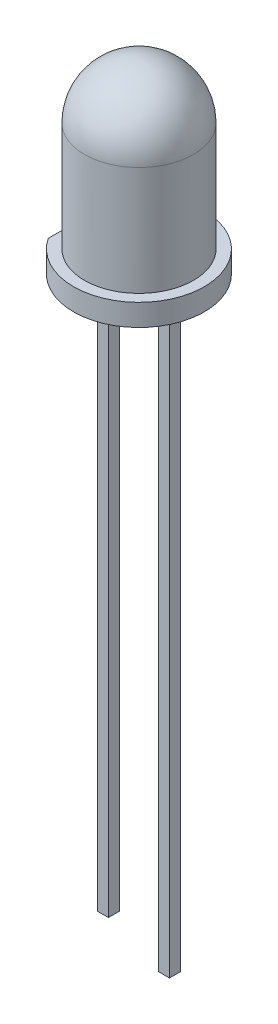
ISO-10303-21;
HEADER;
FILE_DESCRIPTION(('STEP AP214'),'2;1');
FILE_NAME('part.step','',(''),(''),'','','');
FILE_SCHEMA(('AUTOMOTIVE_DESIGN { 1 0 10303 214 1 1 1 1 }'));
ENDSEC;
DATA;
#1=APPLICATION_CONTEXT('core data for automotive mechanical design processes');
#2=APPLICATION_PROTOCOL_DEFINITION('international standard','automotive_design',2000,#1);
#3=PRODUCT_CONTEXT('',#1,'mechanical');
#4=PRODUCT('Part','Part','',(#3));
#5=PRODUCT_RELATED_PRODUCT_CATEGORY('part','',(#4));
#6=PRODUCT_DEFINITION_FORMATION('','',#4);
#7=PRODUCT_DEFINITION_CONTEXT('part definition',#1,'design');
#8=PRODUCT_DEFINITION('design','',#6,#7);
#9=PRODUCT_DEFINITION_SHAPE('','',#8);
#10=(LENGTH_UNIT() NAMED_UNIT(*) SI_UNIT(.MILLI.,.METRE.));
#11=(NAMED_UNIT(*) PLANE_ANGLE_UNIT() SI_UNIT($,.RADIAN.));
#12=(NAMED_UNIT(*) SI_UNIT($,.STERADIAN.) SOLID_ANGLE_UNIT());
#13=UNCERTAINTY_MEASURE_WITH_UNIT(LENGTH_MEASURE(1.E-05),#10,'distance_accuracy_value','');
#14=(GEOMETRIC_REPRESENTATION_CONTEXT(3) GLOBAL_UNCERTAINTY_ASSIGNED_CONTEXT((#13)) GLOBAL_UNIT_ASSIGNED_CONTEXT((#10,
#11,#12)) REPRESENTATION_CONTEXT('',''));
#15=CARTESIAN_POINT('',(0.,0.,0.));
#16=DIRECTION('',(0.,0.,1.));
#17=DIRECTION('',(1.,0.,0.));
#18=AXIS2_PLACEMENT_3D('',#15,#16,#17);
#19=CARTESIAN_POINT('',(0.,1.,0.));
#20=DIRECTION('',(0.,-1.,0.));
#21=DIRECTION('',(0.,0.,-1.));
#22=AXIS2_PLACEMENT_3D('',#19,#20,#21);
#23=CYLINDRICAL_SURFACE('',#22,3.);
#24=CARTESIAN_POINT('',(0.,0.,0.));
#25=DIRECTION('',(0.,1.,0.));
#26=DIRECTION('',(0.,0.,1.));
#27=AXIS2_PLACEMENT_3D('',#24,#25,#26);
#28=CIRCLE('',#27,3.);
#29=CARTESIAN_POINT('',(-2.5,0.,1.6583123951777));
#30=VERTEX_POINT('',#29);
#31=CARTESIAN_POINT('',(-2.5,0.,-1.6583123951777));
#32=VERTEX_POINT('',#31);
#33=EDGE_CURVE('E183',#30,#32,#28,.T.);
#34=ORIENTED_EDGE('',*,*,#33,.T.);
#35=DIRECTION('',(0.,-1.,0.));
#36=VECTOR('',#35,1.);
#37=CARTESIAN_POINT('',(-2.5,1.,-1.6583123951777));
#38=LINE('',#37,#36);
#39=CARTESIAN_POINT('',(-2.5,1.,-1.6583123951777));
#40=VERTEX_POINT('',#39);
#41=EDGE_CURVE('E40',#40,#32,#38,.T.);
#42=ORIENTED_EDGE('',*,*,#41,.F.);
#43=CARTESIAN_POINT('',(0.,1.,0.));
#44=DIRECTION('',(0.,1.,0.));
#45=DIRECTION('',(0.,0.,1.));
#46=AXIS2_PLACEMENT_3D('',#43,#44,#45);
#47=CIRCLE('',#46,3.);
#48=CARTESIAN_POINT('',(-2.5,1.,1.6583123951777));
#49=VERTEX_POINT('',#48);
#50=EDGE_CURVE('E184',#49,#40,#47,.T.);
#51=ORIENTED_EDGE('',*,*,#50,.F.);
#52=DIRECTION('',(0.,-1.,0.));
#53=VECTOR('',#52,1.);
#54=CARTESIAN_POINT('',(-2.5,1.,1.6583123951777));
#55=LINE('',#54,#53);
#56=EDGE_CURVE('E191',#49,#30,#55,.T.);
#57=ORIENTED_EDGE('',*,*,#56,.T.);
#58=EDGE_LOOP('',(#34,#42,#51,#57));
#59=FACE_BOUND('',#58,.T.);
#60=ADVANCED_FACE('F32',(#59),#23,.T.);
#61=CARTESIAN_POINT('',(-2.5,1.,-1.6583123951777));
#62=DIRECTION('',(1.,0.,0.));
#63=DIRECTION('',(0.,0.,-1.));
#64=AXIS2_PLACEMENT_3D('',#61,#62,#63);
#65=PLANE('',#64);
#66=DIRECTION('',(0.,0.,1.));
#67=VECTOR('',#66,1.);
#68=CARTESIAN_POINT('',(-2.5,0.,-1.6583123951777));
#69=LINE('',#68,#67);
#70=EDGE_CURVE('E188',#32,#30,#69,.T.);
#71=ORIENTED_EDGE('',*,*,#70,.T.);
#72=ORIENTED_EDGE('',*,*,#56,.F.);
#73=DIRECTION('',(0.,0.,1.));
#74=VECTOR('',#73,1.);
#75=CARTESIAN_POINT('',(-2.5,1.,-1.6583123951777));
#76=LINE('',#75,#74);
#77=CARTESIAN_POINT('',(-2.5,1.,0.));
#78=VERTEX_POINT('',#77);
#79=EDGE_CURVE('E187',#78,#49,#76,.T.);
#80=ORIENTED_EDGE('',*,*,#79,.F.);
#81=EDGE_CURVE('E189',#40,#78,#76,.T.);
#82=ORIENTED_EDGE('',*,*,#81,.F.);
#83=ORIENTED_EDGE('',*,*,#41,.T.);
#84=EDGE_LOOP('',(#71,#72,#80,#82,#83));
#85=FACE_BOUND('',#84,.T.);
#86=ADVANCED_FACE('F199',(#85),#65,.F.);
#87=CARTESIAN_POINT('',(0.,1.,0.));
#88=DIRECTION('',(0.,1.,0.));
#89=DIRECTION('',(0.,0.,1.));
#90=AXIS2_PLACEMENT_3D('',#87,#88,#89);
#91=PLANE('',#90);
#92=ORIENTED_EDGE('',*,*,#81,.T.);
#93=CARTESIAN_POINT('',(0.,1.,0.));
#94=DIRECTION('',(0.,1.,0.));
#95=DIRECTION('',(0.,0.,1.));
#96=AXIS2_PLACEMENT_3D('',#93,#94,#95);
#97=CIRCLE('',#96,2.5);
#98=EDGE_CURVE('E175',#78,#78,#97,.T.);
#99=ORIENTED_EDGE('',*,*,#98,.F.);
#100=ORIENTED_EDGE('',*,*,#79,.T.);
#101=ORIENTED_EDGE('',*,*,#50,.T.);
#102=EDGE_LOOP('',(#92,#99,#100,#101));
#103=FACE_BOUND('',#102,.T.);
#104=ADVANCED_FACE('F209',(#103),#91,.T.);
#105=CARTESIAN_POINT('',(0.,0.,0.));
#106=DIRECTION('',(0.,1.,0.));
#107=DIRECTION('',(0.,0.,1.));
#108=AXIS2_PLACEMENT_3D('',#105,#106,#107);
#109=PLANE('',#108);
#110=DIRECTION('',(1.,0.,0.));
#111=VECTOR('',#110,1.);
#112=CARTESIAN_POINT('',(1.65,0.,0.25));
#113=LINE('',#112,#111);
#114=CARTESIAN_POINT('',(1.15,0.,0.25));
#115=VERTEX_POINT('',#114);
#116=CARTESIAN_POINT('',(1.65,0.,0.25));
#117=VERTEX_POINT('',#116);
#118=EDGE_CURVE('E143',#115,#117,#113,.T.);
#119=ORIENTED_EDGE('',*,*,#118,.T.);
#120=DIRECTION('',(0.,0.,-1.));
#121=VECTOR('',#120,1.);
#122=CARTESIAN_POINT('',(1.65,0.,-0.25));
#123=LINE('',#122,#121);
#124=CARTESIAN_POINT('',(1.65,0.,-0.25));
#125=VERTEX_POINT('',#124);
#126=EDGE_CURVE('E137',#117,#125,#123,.T.);
#127=ORIENTED_EDGE('',*,*,#126,.T.);
#128=DIRECTION('',(-1.,0.,0.));
#129=VECTOR('',#128,1.);
#130=CARTESIAN_POINT('',(1.65,0.,-0.25));
#131=LINE('',#130,#129);
#132=CARTESIAN_POINT('',(1.15,0.,-0.25));
#133=VERTEX_POINT('',#132);
#134=EDGE_CURVE('E140',#125,#133,#131,.T.);
#135=ORIENTED_EDGE('',*,*,#134,.T.);
#136=DIRECTION('',(0.,0.,1.));
#137=VECTOR('',#136,1.);
#138=CARTESIAN_POINT('',(1.15,0.,-0.25));
#139=LINE('',#138,#137);
#140=EDGE_CURVE('E47',#133,#115,#139,.T.);
#141=ORIENTED_EDGE('',*,*,#140,.T.);
#142=EDGE_LOOP('',(#119,#127,#135,#141));
#143=FACE_BOUND('',#142,.T.);
#144=DIRECTION('',(1.,0.,0.));
#145=VECTOR('',#144,1.);
#146=CARTESIAN_POINT('',(-1.65,0.,0.25));
#147=LINE('',#146,#145);
#148=CARTESIAN_POINT('',(-1.65,0.,0.25));
#149=VERTEX_POINT('',#148);
#150=CARTESIAN_POINT('',(-1.15,0.,0.25));
#151=VERTEX_POINT('',#150);
#152=EDGE_CURVE('E155',#149,#151,#147,.T.);
#153=ORIENTED_EDGE('',*,*,#152,.T.);
#154=DIRECTION('',(0.,0.,-1.));
#155=VECTOR('',#154,1.);
#156=CARTESIAN_POINT('',(-1.15,0.,-0.25));
#157=LINE('',#156,#155);
#158=CARTESIAN_POINT('',(-1.15,0.,-0.25));
#159=VERTEX_POINT('',#158);
#160=EDGE_CURVE('E148',#151,#159,#157,.T.);
#161=ORIENTED_EDGE('',*,*,#160,.T.);
#162=DIRECTION('',(-1.,0.,0.));
#163=VECTOR('',#162,1.);
#164=CARTESIAN_POINT('',(-1.65,0.,-0.25));
#165=LINE('',#164,#163);
#166=CARTESIAN_POINT('',(-1.65,0.,-0.25));
#167=VERTEX_POINT('',#166);
#168=EDGE_CURVE('E167',#159,#167,#165,.T.);
#169=ORIENTED_EDGE('',*,*,#168,.T.);
#170=DIRECTION('',(0.,0.,1.));
#171=VECTOR('',#170,1.);
#172=CARTESIAN_POINT('',(-1.65,0.,-0.25));
#173=LINE('',#172,#171);
#174=EDGE_CURVE('E55',#167,#149,#173,.T.);
#175=ORIENTED_EDGE('',*,*,#174,.T.);
#176=EDGE_LOOP('',(#153,#161,#169,#175));
#177=FACE_BOUND('',#176,.T.);
#178=ORIENTED_EDGE('',*,*,#33,.F.);
#179=ORIENTED_EDGE('',*,*,#70,.F.);
#180=EDGE_LOOP('',(#178,#179));
#181=FACE_BOUND('',#180,.T.);
#182=ADVANCED_FACE('F206',(#143,#177,#181),#109,.F.);
#183=CARTESIAN_POINT('',(0.,8.5,0.));
#184=DIRECTION('',(0.,-1.,0.));
#185=DIRECTION('',(0.,0.,-1.));
#186=AXIS2_PLACEMENT_3D('',#183,#184,#185);
#187=CYLINDRICAL_SURFACE('',#186,2.5);
#188=CARTESIAN_POINT('',(0.,6.,0.));
#189=DIRECTION('',(0.,-1.,0.));
#190=DIRECTION('',(0.,0.,-1.));
#191=AXIS2_PLACEMENT_3D('',#188,#189,#190);
#192=CIRCLE('',#191,2.5);
#193=CARTESIAN_POINT('',(0.,6.,-2.5));
#194=VERTEX_POINT('',#193);
#195=EDGE_CURVE('E11',#194,#194,#192,.T.);
#196=ORIENTED_EDGE('',*,*,#195,.T.);
#197=EDGE_LOOP('',(#196));
#198=FACE_BOUND('',#197,.T.);
#199=ORIENTED_EDGE('',*,*,#98,.T.);
#200=EDGE_LOOP('',(#199));
#201=FACE_BOUND('',#200,.T.);
#202=ADVANCED_FACE('F208',(#198,#201),#187,.T.);
#203=CARTESIAN_POINT('',(0.,6.,0.));
#204=DIRECTION('',(0.,1.,0.));
#205=DIRECTION('',(0.,0.,1.));
#206=AXIS2_PLACEMENT_3D('',#203,#204,#205);
#207=SPHERICAL_SURFACE('',#206,2.5);
#208=ORIENTED_EDGE('',*,*,#195,.F.);
#209=EDGE_LOOP('',(#208));
#210=FACE_BOUND('',#209,.T.);
#211=ADVANCED_FACE('F34',(#210),#207,.T.);
#212=CARTESIAN_POINT('',(-1.15,-26.,-0.25));
#213=DIRECTION('',(1.,0.,0.));
#214=DIRECTION('',(0.,0.,-1.));
#215=AXIS2_PLACEMENT_3D('',#212,#213,#214);
#216=PLANE('',#215);
#217=ORIENTED_EDGE('',*,*,#160,.F.);
#218=DIRECTION('',(0.,1.,0.));
#219=VECTOR('',#218,1.);
#220=CARTESIAN_POINT('',(-1.15,-26.,0.25));
#221=LINE('',#220,#219);
#222=CARTESIAN_POINT('',(-1.15,-26.,0.25));
#223=VERTEX_POINT('',#222);
#224=EDGE_CURVE('E173',#223,#151,#221,.T.);
#225=ORIENTED_EDGE('',*,*,#224,.F.);
#226=DIRECTION('',(0.,0.,-1.));
#227=VECTOR('',#226,1.);
#228=CARTESIAN_POINT('',(-1.15,-26.,-0.25));
#229=LINE('',#228,#227);
#230=CARTESIAN_POINT('',(-1.15,-26.,-0.25));
#231=VERTEX_POINT('',#230);
#232=EDGE_CURVE('E151',#223,#231,#229,.T.);
#233=ORIENTED_EDGE('',*,*,#232,.T.);
#234=DIRECTION('',(0.,1.,0.));
#235=VECTOR('',#234,1.);
#236=CARTESIAN_POINT('',(-1.15,-26.,-0.25));
#237=LINE('',#236,#235);
#238=EDGE_CURVE('E164',#231,#159,#237,.T.);
#239=ORIENTED_EDGE('',*,*,#238,.T.);
#240=EDGE_LOOP('',(#217,#225,#233,#239));
#241=FACE_BOUND('',#240,.T.);
#242=ADVANCED_FACE('F247',(#241),#216,.T.);
#243=CARTESIAN_POINT('',(-1.65,-26.,0.25));
#244=DIRECTION('',(0.,0.,1.));
#245=DIRECTION('',(1.,0.,0.));
#246=AXIS2_PLACEMENT_3D('',#243,#244,#245);
#247=PLANE('',#246);
#248=ORIENTED_EDGE('',*,*,#152,.F.);
#249=DIRECTION('',(0.,1.,0.));
#250=VECTOR('',#249,1.);
#251=CARTESIAN_POINT('',(-1.65,-26.,0.25));
#252=LINE('',#251,#250);
#253=CARTESIAN_POINT('',(-1.65,-26.,0.25));
#254=VERTEX_POINT('',#253);
#255=EDGE_CURVE('E176',#254,#149,#252,.T.);
#256=ORIENTED_EDGE('',*,*,#255,.F.);
#257=DIRECTION('',(1.,0.,0.));
#258=VECTOR('',#257,1.);
#259=CARTESIAN_POINT('',(-1.65,-26.,0.25));
#260=LINE('',#259,#258);
#261=EDGE_CURVE('E161',#254,#223,#260,.T.);
#262=ORIENTED_EDGE('',*,*,#261,.T.);
#263=ORIENTED_EDGE('',*,*,#224,.T.);
#264=EDGE_LOOP('',(#248,#256,#262,#263));
#265=FACE_BOUND('',#264,.T.);
#266=ADVANCED_FACE('F260',(#265),#247,.T.);
#267=CARTESIAN_POINT('',(-1.65,-26.,-0.25));
#268=DIRECTION('',(-1.,0.,0.));
#269=DIRECTION('',(0.,0.,1.));
#270=AXIS2_PLACEMENT_3D('',#267,#268,#269);
#271=PLANE('',#270);
#272=ORIENTED_EDGE('',*,*,#174,.F.);
#273=DIRECTION('',(0.,1.,0.));
#274=VECTOR('',#273,1.);
#275=CARTESIAN_POINT('',(-1.65,-26.,-0.25));
#276=LINE('',#275,#274);
#277=CARTESIAN_POINT('',(-1.65,-26.,-0.25));
#278=VERTEX_POINT('',#277);
#279=EDGE_CURVE('E178',#278,#167,#276,.T.);
#280=ORIENTED_EDGE('',*,*,#279,.F.);
#281=DIRECTION('',(0.,0.,1.));
#282=VECTOR('',#281,1.);
#283=CARTESIAN_POINT('',(-1.65,-26.,-0.25));
#284=LINE('',#283,#282);
#285=EDGE_CURVE('E158',#278,#254,#284,.T.);
#286=ORIENTED_EDGE('',*,*,#285,.T.);
#287=ORIENTED_EDGE('',*,*,#255,.T.);
#288=EDGE_LOOP('',(#272,#280,#286,#287));
#289=FACE_BOUND('',#288,.T.);
#290=ADVANCED_FACE('F270',(#289),#271,.T.);
#291=CARTESIAN_POINT('',(-1.65,-26.,-0.25));
#292=DIRECTION('',(0.,0.,-1.));
#293=DIRECTION('',(-1.,0.,0.));
#294=AXIS2_PLACEMENT_3D('',#291,#292,#293);
#295=PLANE('',#294);
#296=ORIENTED_EDGE('',*,*,#168,.F.);
#297=ORIENTED_EDGE('',*,*,#238,.F.);
#298=DIRECTION('',(-1.,0.,0.));
#299=VECTOR('',#298,1.);
#300=CARTESIAN_POINT('',(-1.65,-26.,-0.25));
#301=LINE('',#300,#299);
#302=EDGE_CURVE('E154',#231,#278,#301,.T.);
#303=ORIENTED_EDGE('',*,*,#302,.T.);
#304=ORIENTED_EDGE('',*,*,#279,.T.);
#305=EDGE_LOOP('',(#296,#297,#303,#304));
#306=FACE_BOUND('',#305,.T.);
#307=ADVANCED_FACE('F280',(#306),#295,.T.);
#308=CARTESIAN_POINT('',(0.,-26.,0.));
#309=DIRECTION('',(0.,1.,0.));
#310=DIRECTION('',(0.,0.,1.));
#311=AXIS2_PLACEMENT_3D('',#308,#309,#310);
#312=PLANE('',#311);
#313=ORIENTED_EDGE('',*,*,#232,.F.);
#314=ORIENTED_EDGE('',*,*,#261,.F.);
#315=ORIENTED_EDGE('',*,*,#285,.F.);
#316=ORIENTED_EDGE('',*,*,#302,.F.);
#317=EDGE_LOOP('',(#313,#314,#315,#316));
#318=FACE_BOUND('',#317,.T.);
#319=ADVANCED_FACE('F289',(#318),#312,.F.);
#320=CARTESIAN_POINT('',(1.65,-26.,-0.25));
#321=DIRECTION('',(1.,0.,0.));
#322=DIRECTION('',(0.,0.,-1.));
#323=AXIS2_PLACEMENT_3D('',#320,#321,#322);
#324=PLANE('',#323);
#325=ORIENTED_EDGE('',*,*,#126,.F.);
#326=DIRECTION('',(0.,1.,0.));
#327=VECTOR('',#326,1.);
#328=CARTESIAN_POINT('',(1.65,-26.,0.25));
#329=LINE('',#328,#327);
#330=CARTESIAN_POINT('',(1.65,-27.,0.25));
#331=VERTEX_POINT('',#330);
#332=EDGE_CURVE('E146',#331,#117,#329,.T.);
#333=ORIENTED_EDGE('',*,*,#332,.F.);
#334=DIRECTION('',(0.,0.,1.));
#335=VECTOR('',#334,1.);
#336=CARTESIAN_POINT('',(1.65,-27.,-0.25));
#337=LINE('',#336,#335);
#338=CARTESIAN_POINT('',(1.65,-27.,-0.25));
#339=VERTEX_POINT('',#338);
#340=EDGE_CURVE('E127',#339,#331,#337,.T.);
#341=ORIENTED_EDGE('',*,*,#340,.F.);
#342=DIRECTION('',(0.,1.,0.));
#343=VECTOR('',#342,1.);
#344=CARTESIAN_POINT('',(1.65,-26.,-0.25));
#345=LINE('',#344,#343);
#346=EDGE_CURVE('E119',#339,#125,#345,.T.);
#347=ORIENTED_EDGE('',*,*,#346,.T.);
#348=EDGE_LOOP('',(#325,#333,#341,#347));
#349=FACE_BOUND('',#348,.T.);
#350=ADVANCED_FACE('F299',(#349),#324,.T.);
#351=CARTESIAN_POINT('',(1.65,-26.,0.25));
#352=DIRECTION('',(0.,0.,1.));
#353=DIRECTION('',(1.,0.,0.));
#354=AXIS2_PLACEMENT_3D('',#351,#352,#353);
#355=PLANE('',#354);
#356=ORIENTED_EDGE('',*,*,#118,.F.);
#357=DIRECTION('',(0.,1.,0.));
#358=VECTOR('',#357,1.);
#359=CARTESIAN_POINT('',(1.15,-26.,0.25));
#360=LINE('',#359,#358);
#361=CARTESIAN_POINT('',(1.15,-27.,0.25));
#362=VERTEX_POINT('',#361);
#363=EDGE_CURVE('E118',#362,#115,#360,.T.);
#364=ORIENTED_EDGE('',*,*,#363,.F.);
#365=DIRECTION('',(-1.,0.,0.));
#366=VECTOR('',#365,1.);
#367=CARTESIAN_POINT('',(1.15,-27.,0.25));
#368=LINE('',#367,#366);
#369=EDGE_CURVE('E132',#331,#362,#368,.T.);
#370=ORIENTED_EDGE('',*,*,#369,.F.);
#371=ORIENTED_EDGE('',*,*,#332,.T.);
#372=EDGE_LOOP('',(#356,#364,#370,#371));
#373=FACE_BOUND('',#372,.T.);
#374=ADVANCED_FACE('F310',(#373),#355,.T.);
#375=CARTESIAN_POINT('',(1.15,-26.,-0.25));
#376=DIRECTION('',(-1.,0.,0.));
#377=DIRECTION('',(0.,0.,1.));
#378=AXIS2_PLACEMENT_3D('',#375,#376,#377);
#379=PLANE('',#378);
#380=ORIENTED_EDGE('',*,*,#140,.F.);
#381=DIRECTION('',(0.,1.,0.));
#382=VECTOR('',#381,1.);
#383=CARTESIAN_POINT('',(1.15,-26.,-0.25));
#384=LINE('',#383,#382);
#385=CARTESIAN_POINT('',(1.15,-27.,-0.25));
#386=VERTEX_POINT('',#385);
#387=EDGE_CURVE('E110',#386,#133,#384,.T.);
#388=ORIENTED_EDGE('',*,*,#387,.F.);
#389=DIRECTION('',(0.,0.,-1.));
#390=VECTOR('',#389,1.);
#391=CARTESIAN_POINT('',(1.15,-27.,-0.25));
#392=LINE('',#391,#390);
#393=EDGE_CURVE('E114',#362,#386,#392,.T.);
#394=ORIENTED_EDGE('',*,*,#393,.F.);
#395=ORIENTED_EDGE('',*,*,#363,.T.);
#396=EDGE_LOOP('',(#380,#388,#394,#395));
#397=FACE_BOUND('',#396,.T.);
#398=ADVANCED_FACE('F112',(#397),#379,.T.);
#399=CARTESIAN_POINT('',(1.65,-26.,-0.25));
#400=DIRECTION('',(0.,0.,-1.));
#401=DIRECTION('',(-1.,0.,0.));
#402=AXIS2_PLACEMENT_3D('',#399,#400,#401);
#403=PLANE('',#402);
#404=ORIENTED_EDGE('',*,*,#134,.F.);
#405=ORIENTED_EDGE('',*,*,#346,.F.);
#406=DIRECTION('',(1.,0.,0.));
#407=VECTOR('',#406,1.);
#408=CARTESIAN_POINT('',(1.15,-27.,-0.25));
#409=LINE('',#408,#407);
#410=EDGE_CURVE('E122',#386,#339,#409,.T.);
#411=ORIENTED_EDGE('',*,*,#410,.F.);
#412=ORIENTED_EDGE('',*,*,#387,.T.);
#413=EDGE_LOOP('',(#404,#405,#411,#412));
#414=FACE_BOUND('',#413,.T.);
#415=ADVANCED_FACE('F123',(#414),#403,.T.);
#416=CARTESIAN_POINT('',(0.,-27.,0.));
#417=DIRECTION('',(0.,1.,0.));
#418=DIRECTION('',(0.,0.,1.));
#419=AXIS2_PLACEMENT_3D('',#416,#417,#418);
#420=PLANE('',#419);
#421=ORIENTED_EDGE('',*,*,#393,.T.);
#422=ORIENTED_EDGE('',*,*,#410,.T.);
#423=ORIENTED_EDGE('',*,*,#340,.T.);
#424=ORIENTED_EDGE('',*,*,#369,.T.);
#425=EDGE_LOOP('',(#421,#422,#423,#424));
#426=FACE_BOUND('',#425,.T.);
#427=ADVANCED_FACE('F130',(#426),#420,.F.);
#428=CLOSED_SHELL('',(#60,#86,#104,#182,#202,#211,#242,#266,#290,#307,#319,#350,#374,#398,#415,#427));
#429=MANIFOLD_SOLID_BREP('B2',#428);
#430=ADVANCED_BREP_SHAPE_REPRESENTATION('',(#18,#429),#14);
#431=SHAPE_DEFINITION_REPRESENTATION(#9,#430);
ENDSEC;
END-ISO-10303-21;
